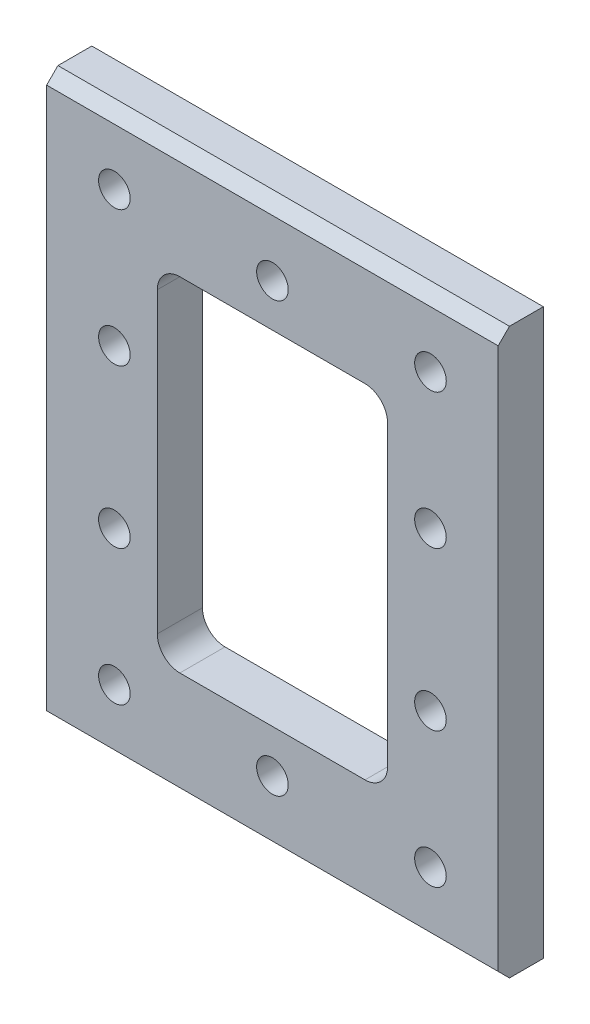
ISO-10303-21;
HEADER;
FILE_DESCRIPTION(('STEP AP214'),'2;1');
FILE_NAME('part.step','',(''),(''),'','','');
FILE_SCHEMA(('AUTOMOTIVE_DESIGN { 1 0 10303 214 1 1 1 1 }'));
ENDSEC;
DATA;
#1=APPLICATION_CONTEXT('core data for automotive mechanical design processes');
#2=APPLICATION_PROTOCOL_DEFINITION('international standard','automotive_design',2000,#1);
#3=PRODUCT_CONTEXT('',#1,'mechanical');
#4=PRODUCT('Part','Part','',(#3));
#5=PRODUCT_RELATED_PRODUCT_CATEGORY('part','',(#4));
#6=PRODUCT_DEFINITION_FORMATION('','',#4);
#7=PRODUCT_DEFINITION_CONTEXT('part definition',#1,'design');
#8=PRODUCT_DEFINITION('design','',#6,#7);
#9=PRODUCT_DEFINITION_SHAPE('','',#8);
#10=(LENGTH_UNIT() NAMED_UNIT(*) SI_UNIT(.MILLI.,.METRE.));
#11=(NAMED_UNIT(*) PLANE_ANGLE_UNIT() SI_UNIT($,.RADIAN.));
#12=(NAMED_UNIT(*) SI_UNIT($,.STERADIAN.) SOLID_ANGLE_UNIT());
#13=UNCERTAINTY_MEASURE_WITH_UNIT(LENGTH_MEASURE(1.E-05),#10,'distance_accuracy_value','');
#14=(GEOMETRIC_REPRESENTATION_CONTEXT(3) GLOBAL_UNCERTAINTY_ASSIGNED_CONTEXT((#13)) GLOBAL_UNIT_ASSIGNED_CONTEXT((#10,
#11,#12)) REPRESENTATION_CONTEXT('',''));
#15=CARTESIAN_POINT('',(0.,0.,0.));
#16=DIRECTION('',(0.,0.,1.));
#17=DIRECTION('',(1.,0.,0.));
#18=AXIS2_PLACEMENT_3D('',#15,#16,#17);
#19=CARTESIAN_POINT('',(100.,125.,20.));
#20=DIRECTION('',(-1.,0.,0.));
#21=DIRECTION('',(0.,-1.,0.));
#22=AXIS2_PLACEMENT_3D('',#19,#20,#21);
#23=PLANE('',#22);
#24=DIRECTION('',(0.,1.,0.));
#25=VECTOR('',#24,1.);
#26=CARTESIAN_POINT('',(100.,125.,20.));
#27=LINE('',#26,#25);
#28=CARTESIAN_POINT('',(100.,-120.,20.));
#29=VERTEX_POINT('',#28);
#30=CARTESIAN_POINT('',(100.,120.,20.));
#31=VERTEX_POINT('',#30);
#32=EDGE_CURVE('E201',#29,#31,#27,.T.);
#33=ORIENTED_EDGE('',*,*,#32,.F.);
#34=DIRECTION('',(0.,-0.707106781186546,-0.707106781186549));
#35=VECTOR('',#34,1.);
#36=CARTESIAN_POINT('',(100.,-120.,20.));
#37=LINE('',#36,#35);
#38=CARTESIAN_POINT('',(100.,-125.,15.));
#39=VERTEX_POINT('',#38);
#40=EDGE_CURVE('E234',#29,#39,#37,.T.);
#41=ORIENTED_EDGE('',*,*,#40,.T.);
#42=DIRECTION('',(0.,0.,-1.));
#43=VECTOR('',#42,1.);
#44=CARTESIAN_POINT('',(100.,-125.,20.));
#45=LINE('',#44,#43);
#46=CARTESIAN_POINT('',(100.,-125.,0.));
#47=VERTEX_POINT('',#46);
#48=EDGE_CURVE('E208',#39,#47,#45,.T.);
#49=ORIENTED_EDGE('',*,*,#48,.T.);
#50=DIRECTION('',(0.,1.,0.));
#51=VECTOR('',#50,1.);
#52=CARTESIAN_POINT('',(100.,125.,0.));
#53=LINE('',#52,#51);
#54=CARTESIAN_POINT('',(100.,125.,0.));
#55=VERTEX_POINT('',#54);
#56=EDGE_CURVE('E156',#47,#55,#53,.T.);
#57=ORIENTED_EDGE('',*,*,#56,.T.);
#58=DIRECTION('',(0.,0.,-1.));
#59=VECTOR('',#58,1.);
#60=CARTESIAN_POINT('',(100.,125.,20.));
#61=LINE('',#60,#59);
#62=CARTESIAN_POINT('',(100.,125.,15.));
#63=VERTEX_POINT('',#62);
#64=EDGE_CURVE('E224',#63,#55,#61,.T.);
#65=ORIENTED_EDGE('',*,*,#64,.F.);
#66=DIRECTION('',(0.,-0.707106781186546,0.707106781186549));
#67=VECTOR('',#66,1.);
#68=CARTESIAN_POINT('',(100.,120.,20.));
#69=LINE('',#68,#67);
#70=EDGE_CURVE('E232',#63,#31,#69,.T.);
#71=ORIENTED_EDGE('',*,*,#70,.T.);
#72=EDGE_LOOP('',(#33,#41,#49,#57,#65,#71));
#73=FACE_BOUND('',#72,.T.);
#74=ADVANCED_FACE('F35',(#73),#23,.F.);
#75=CARTESIAN_POINT('',(-100.,125.,20.));
#76=DIRECTION('',(0.,-1.,0.));
#77=DIRECTION('',(0.,0.,-1.));
#78=AXIS2_PLACEMENT_3D('',#75,#76,#77);
#79=PLANE('',#78);
#80=DIRECTION('',(0.,0.,-1.));
#81=VECTOR('',#80,1.);
#82=CARTESIAN_POINT('',(-100.,125.,20.));
#83=LINE('',#82,#81);
#84=CARTESIAN_POINT('',(-100.,125.,15.));
#85=VERTEX_POINT('',#84);
#86=CARTESIAN_POINT('',(-100.,125.,0.));
#87=VERTEX_POINT('',#86);
#88=EDGE_CURVE('E222',#85,#87,#83,.T.);
#89=ORIENTED_EDGE('',*,*,#88,.F.);
#90=DIRECTION('',(1.,0.,0.));
#91=VECTOR('',#90,1.);
#92=CARTESIAN_POINT('',(100.,125.,15.));
#93=LINE('',#92,#91);
#94=EDGE_CURVE('E11',#85,#63,#93,.T.);
#95=ORIENTED_EDGE('',*,*,#94,.T.);
#96=ORIENTED_EDGE('',*,*,#64,.T.);
#97=DIRECTION('',(-1.,0.,0.));
#98=VECTOR('',#97,1.);
#99=CARTESIAN_POINT('',(-100.,125.,0.));
#100=LINE('',#99,#98);
#101=EDGE_CURVE('E211',#55,#87,#100,.T.);
#102=ORIENTED_EDGE('',*,*,#101,.T.);
#103=EDGE_LOOP('',(#89,#95,#96,#102));
#104=FACE_BOUND('',#103,.T.);
#105=ADVANCED_FACE('F257',(#104),#79,.F.);
#106=CARTESIAN_POINT('',(-100.,125.,20.));
#107=DIRECTION('',(1.,0.,0.));
#108=DIRECTION('',(0.,1.,0.));
#109=AXIS2_PLACEMENT_3D('',#106,#107,#108);
#110=PLANE('',#109);
#111=DIRECTION('',(0.,0.,-1.));
#112=VECTOR('',#111,1.);
#113=CARTESIAN_POINT('',(-100.,-125.,20.));
#114=LINE('',#113,#112);
#115=CARTESIAN_POINT('',(-100.,-125.,15.));
#116=VERTEX_POINT('',#115);
#117=CARTESIAN_POINT('',(-100.,-125.,0.));
#118=VERTEX_POINT('',#117);
#119=EDGE_CURVE('E220',#116,#118,#114,.T.);
#120=ORIENTED_EDGE('',*,*,#119,.F.);
#121=DIRECTION('',(0.,0.707106781186546,0.707106781186549));
#122=VECTOR('',#121,1.);
#123=CARTESIAN_POINT('',(-100.,-120.,20.));
#124=LINE('',#123,#122);
#125=CARTESIAN_POINT('',(-100.,-120.,20.));
#126=VERTEX_POINT('',#125);
#127=EDGE_CURVE('E43',#116,#126,#124,.T.);
#128=ORIENTED_EDGE('',*,*,#127,.T.);
#129=DIRECTION('',(0.,-1.,0.));
#130=VECTOR('',#129,1.);
#131=CARTESIAN_POINT('',(-100.,125.,20.));
#132=LINE('',#131,#130);
#133=CARTESIAN_POINT('',(-100.,120.,20.));
#134=VERTEX_POINT('',#133);
#135=EDGE_CURVE('E204',#134,#126,#132,.T.);
#136=ORIENTED_EDGE('',*,*,#135,.F.);
#137=DIRECTION('',(0.,0.707106781186546,-0.707106781186549));
#138=VECTOR('',#137,1.);
#139=CARTESIAN_POINT('',(-100.,120.,20.));
#140=LINE('',#139,#138);
#141=EDGE_CURVE('E50',#134,#85,#140,.T.);
#142=ORIENTED_EDGE('',*,*,#141,.T.);
#143=ORIENTED_EDGE('',*,*,#88,.T.);
#144=DIRECTION('',(0.,-1.,0.));
#145=VECTOR('',#144,1.);
#146=CARTESIAN_POINT('',(-100.,125.,0.));
#147=LINE('',#146,#145);
#148=EDGE_CURVE('E214',#87,#118,#147,.T.);
#149=ORIENTED_EDGE('',*,*,#148,.T.);
#150=EDGE_LOOP('',(#120,#128,#136,#142,#143,#149));
#151=FACE_BOUND('',#150,.T.);
#152=ADVANCED_FACE('F238',(#151),#110,.F.);
#153=CARTESIAN_POINT('',(-100.,-125.,20.));
#154=DIRECTION('',(0.,1.,0.));
#155=DIRECTION('',(0.,0.,1.));
#156=AXIS2_PLACEMENT_3D('',#153,#154,#155);
#157=PLANE('',#156);
#158=ORIENTED_EDGE('',*,*,#48,.F.);
#159=DIRECTION('',(-1.,0.,0.));
#160=VECTOR('',#159,1.);
#161=CARTESIAN_POINT('',(-100.,-125.,15.));
#162=LINE('',#161,#160);
#163=EDGE_CURVE('E58',#39,#116,#162,.T.);
#164=ORIENTED_EDGE('',*,*,#163,.T.);
#165=ORIENTED_EDGE('',*,*,#119,.T.);
#166=DIRECTION('',(1.,0.,0.));
#167=VECTOR('',#166,1.);
#168=CARTESIAN_POINT('',(-100.,-125.,0.));
#169=LINE('',#168,#167);
#170=EDGE_CURVE('E205',#118,#47,#169,.T.);
#171=ORIENTED_EDGE('',*,*,#170,.T.);
#172=EDGE_LOOP('',(#158,#164,#165,#171));
#173=FACE_BOUND('',#172,.T.);
#174=ADVANCED_FACE('F247',(#173),#157,.F.);
#175=CARTESIAN_POINT('',(0.,0.,20.));
#176=DIRECTION('',(0.,0.,1.));
#177=DIRECTION('',(1.,0.,0.));
#178=AXIS2_PLACEMENT_3D('',#175,#176,#177);
#179=PLANE('',#178);
#180=CARTESIAN_POINT('',(70.,35.,20.));
#181=DIRECTION('',(0.,0.,1.));
#182=DIRECTION('',(1.,0.,0.));
#183=AXIS2_PLACEMENT_3D('',#180,#181,#182);
#184=CIRCLE('',#183,7.);
#185=CARTESIAN_POINT('',(77.,35.,20.));
#186=VERTEX_POINT('',#185);
#187=EDGE_CURVE('E522',#186,#186,#184,.T.);
#188=ORIENTED_EDGE('',*,*,#187,.F.);
#189=EDGE_LOOP('',(#188));
#190=FACE_BOUND('',#189,.T.);
#191=CARTESIAN_POINT('',(-70.,35.,20.));
#192=DIRECTION('',(0.,0.,1.));
#193=DIRECTION('',(1.,0.,0.));
#194=AXIS2_PLACEMENT_3D('',#191,#192,#193);
#195=CIRCLE('',#194,7.);
#196=CARTESIAN_POINT('',(-63.,35.,20.));
#197=VERTEX_POINT('',#196);
#198=EDGE_CURVE('E516',#197,#197,#195,.T.);
#199=ORIENTED_EDGE('',*,*,#198,.F.);
#200=EDGE_LOOP('',(#199));
#201=FACE_BOUND('',#200,.T.);
#202=CARTESIAN_POINT('',(70.,95.,20.));
#203=DIRECTION('',(0.,0.,1.));
#204=DIRECTION('',(1.,0.,0.));
#205=AXIS2_PLACEMENT_3D('',#202,#203,#204);
#206=CIRCLE('',#205,7.);
#207=CARTESIAN_POINT('',(77.,95.,20.));
#208=VERTEX_POINT('',#207);
#209=EDGE_CURVE('E503',#208,#208,#206,.T.);
#210=ORIENTED_EDGE('',*,*,#209,.F.);
#211=EDGE_LOOP('',(#210));
#212=FACE_BOUND('',#211,.T.);
#213=CARTESIAN_POINT('',(0.,95.,20.));
#214=DIRECTION('',(0.,0.,1.));
#215=DIRECTION('',(1.,0.,0.));
#216=AXIS2_PLACEMENT_3D('',#213,#214,#215);
#217=CIRCLE('',#216,7.);
#218=CARTESIAN_POINT('',(7.00000000000002,95.,20.));
#219=VERTEX_POINT('',#218);
#220=EDGE_CURVE('E508',#219,#219,#217,.T.);
#221=ORIENTED_EDGE('',*,*,#220,.F.);
#222=EDGE_LOOP('',(#221));
#223=FACE_BOUND('',#222,.T.);
#224=CARTESIAN_POINT('',(-70.,95.,20.));
#225=DIRECTION('',(0.,0.,1.));
#226=DIRECTION('',(1.,0.,0.));
#227=AXIS2_PLACEMENT_3D('',#224,#225,#226);
#228=CIRCLE('',#227,7.);
#229=CARTESIAN_POINT('',(-63.,95.,20.));
#230=VERTEX_POINT('',#229);
#231=EDGE_CURVE('E527',#230,#230,#228,.T.);
#232=ORIENTED_EDGE('',*,*,#231,.F.);
#233=EDGE_LOOP('',(#232));
#234=FACE_BOUND('',#233,.T.);
#235=CARTESIAN_POINT('',(70.,-95.,20.));
#236=DIRECTION('',(0.,0.,1.));
#237=DIRECTION('',(-1.,0.,0.));
#238=AXIS2_PLACEMENT_3D('',#235,#236,#237);
#239=CIRCLE('',#238,7.);
#240=CARTESIAN_POINT('',(63.,-95.,20.));
#241=VERTEX_POINT('',#240);
#242=EDGE_CURVE('E550',#241,#241,#239,.T.);
#243=ORIENTED_EDGE('',*,*,#242,.F.);
#244=EDGE_LOOP('',(#243));
#245=FACE_BOUND('',#244,.T.);
#246=CARTESIAN_POINT('',(70.,-35.,20.));
#247=DIRECTION('',(0.,0.,1.));
#248=DIRECTION('',(-1.,0.,0.));
#249=AXIS2_PLACEMENT_3D('',#246,#247,#248);
#250=CIRCLE('',#249,7.);
#251=CARTESIAN_POINT('',(63.,-35.,20.));
#252=VERTEX_POINT('',#251);
#253=EDGE_CURVE('E544',#252,#252,#250,.T.);
#254=ORIENTED_EDGE('',*,*,#253,.F.);
#255=EDGE_LOOP('',(#254));
#256=FACE_BOUND('',#255,.T.);
#257=CARTESIAN_POINT('',(-70.,-95.,20.));
#258=DIRECTION('',(0.,0.,1.));
#259=DIRECTION('',(-1.,0.,0.));
#260=AXIS2_PLACEMENT_3D('',#257,#258,#259);
#261=CIRCLE('',#260,7.);
#262=CARTESIAN_POINT('',(-77.,-95.,20.));
#263=VERTEX_POINT('',#262);
#264=EDGE_CURVE('E536',#263,#263,#261,.T.);
#265=ORIENTED_EDGE('',*,*,#264,.F.);
#266=EDGE_LOOP('',(#265));
#267=FACE_BOUND('',#266,.T.);
#268=CARTESIAN_POINT('',(0.,-95.,20.));
#269=DIRECTION('',(0.,0.,1.));
#270=DIRECTION('',(-1.,0.,0.));
#271=AXIS2_PLACEMENT_3D('',#268,#269,#270);
#272=CIRCLE('',#271,7.);
#273=CARTESIAN_POINT('',(-6.99999999999997,-95.,20.));
#274=VERTEX_POINT('',#273);
#275=EDGE_CURVE('E543',#274,#274,#272,.T.);
#276=ORIENTED_EDGE('',*,*,#275,.F.);
#277=EDGE_LOOP('',(#276));
#278=FACE_BOUND('',#277,.T.);
#279=CARTESIAN_POINT('',(-70.,-35.,20.));
#280=DIRECTION('',(0.,0.,1.));
#281=DIRECTION('',(-1.,0.,0.));
#282=AXIS2_PLACEMENT_3D('',#279,#280,#281);
#283=CIRCLE('',#282,7.);
#284=CARTESIAN_POINT('',(-77.,-35.,20.));
#285=VERTEX_POINT('',#284);
#286=EDGE_CURVE('E555',#285,#285,#283,.T.);
#287=ORIENTED_EDGE('',*,*,#286,.F.);
#288=EDGE_LOOP('',(#287));
#289=FACE_BOUND('',#288,.T.);
#290=CARTESIAN_POINT('',(-41.,-66.,20.));
#291=DIRECTION('',(0.,0.,1.));
#292=DIRECTION('',(1.,0.,0.));
#293=AXIS2_PLACEMENT_3D('',#290,#291,#292);
#294=CIRCLE('',#293,10.);
#295=CARTESIAN_POINT('',(-51.,-65.9999999999999,20.));
#296=VERTEX_POINT('',#295);
#297=CARTESIAN_POINT('',(-40.9999999999999,-76.,20.));
#298=VERTEX_POINT('',#297);
#299=EDGE_CURVE('E143',#296,#298,#294,.T.);
#300=ORIENTED_EDGE('',*,*,#299,.F.);
#301=DIRECTION('',(0.,-1.,0.));
#302=VECTOR('',#301,1.);
#303=CARTESIAN_POINT('',(-51.,65.9999999999999,20.));
#304=LINE('',#303,#302);
#305=CARTESIAN_POINT('',(-51.,65.9999999999999,20.));
#306=VERTEX_POINT('',#305);
#307=EDGE_CURVE('E148',#306,#296,#304,.T.);
#308=ORIENTED_EDGE('',*,*,#307,.F.);
#309=CARTESIAN_POINT('',(-41.,66.,20.));
#310=DIRECTION('',(0.,0.,1.));
#311=DIRECTION('',(1.,0.,0.));
#312=AXIS2_PLACEMENT_3D('',#309,#310,#311);
#313=CIRCLE('',#312,10.);
#314=CARTESIAN_POINT('',(-40.9999999999999,76.,20.));
#315=VERTEX_POINT('',#314);
#316=EDGE_CURVE('E184',#315,#306,#313,.T.);
#317=ORIENTED_EDGE('',*,*,#316,.F.);
#318=DIRECTION('',(-1.,0.,0.));
#319=VECTOR('',#318,1.);
#320=CARTESIAN_POINT('',(-40.9999999999999,76.,20.));
#321=LINE('',#320,#319);
#322=CARTESIAN_POINT('',(40.9999999999999,76.,20.));
#323=VERTEX_POINT('',#322);
#324=EDGE_CURVE('E181',#323,#315,#321,.T.);
#325=ORIENTED_EDGE('',*,*,#324,.F.);
#326=CARTESIAN_POINT('',(41.,66.,20.));
#327=DIRECTION('',(0.,0.,1.));
#328=DIRECTION('',(-1.,0.,0.));
#329=AXIS2_PLACEMENT_3D('',#326,#327,#328);
#330=CIRCLE('',#329,10.);
#331=CARTESIAN_POINT('',(51.,65.9999999999999,20.));
#332=VERTEX_POINT('',#331);
#333=EDGE_CURVE('E178',#332,#323,#330,.T.);
#334=ORIENTED_EDGE('',*,*,#333,.F.);
#335=DIRECTION('',(0.,1.,0.));
#336=VECTOR('',#335,1.);
#337=CARTESIAN_POINT('',(51.,65.9999999999999,20.));
#338=LINE('',#337,#336);
#339=CARTESIAN_POINT('',(51.,-65.9999999999999,20.));
#340=VERTEX_POINT('',#339);
#341=EDGE_CURVE('E175',#340,#332,#338,.T.);
#342=ORIENTED_EDGE('',*,*,#341,.F.);
#343=CARTESIAN_POINT('',(41.,-66.,20.));
#344=DIRECTION('',(0.,0.,1.));
#345=DIRECTION('',(1.,0.,0.));
#346=AXIS2_PLACEMENT_3D('',#343,#344,#345);
#347=CIRCLE('',#346,10.);
#348=CARTESIAN_POINT('',(40.9999999999999,-76.,20.));
#349=VERTEX_POINT('',#348);
#350=EDGE_CURVE('E172',#349,#340,#347,.T.);
#351=ORIENTED_EDGE('',*,*,#350,.F.);
#352=DIRECTION('',(1.,0.,0.));
#353=VECTOR('',#352,1.);
#354=CARTESIAN_POINT('',(-40.9999999999999,-76.,20.));
#355=LINE('',#354,#353);
#356=EDGE_CURVE('E165',#298,#349,#355,.T.);
#357=ORIENTED_EDGE('',*,*,#356,.F.);
#358=EDGE_LOOP('',(#300,#308,#317,#325,#334,#342,#351,#357));
#359=FACE_BOUND('',#358,.T.);
#360=ORIENTED_EDGE('',*,*,#135,.T.);
#361=DIRECTION('',(1.,0.,0.));
#362=VECTOR('',#361,1.);
#363=CARTESIAN_POINT('',(100.,-120.,20.));
#364=LINE('',#363,#362);
#365=EDGE_CURVE('E229',#126,#29,#364,.T.);
#366=ORIENTED_EDGE('',*,*,#365,.T.);
#367=ORIENTED_EDGE('',*,*,#32,.T.);
#368=DIRECTION('',(-1.,0.,0.));
#369=VECTOR('',#368,1.);
#370=CARTESIAN_POINT('',(-100.,120.,20.));
#371=LINE('',#370,#369);
#372=EDGE_CURVE('E226',#31,#134,#371,.T.);
#373=ORIENTED_EDGE('',*,*,#372,.T.);
#374=EDGE_LOOP('',(#360,#366,#367,#373));
#375=FACE_BOUND('',#374,.T.);
#376=ADVANCED_FACE('F242',(#190,#201,#212,#223,#234,#245,#256,#267,#278,#289,#359,#375),#179,.T.);
#377=CARTESIAN_POINT('',(0.,0.,0.));
#378=DIRECTION('',(0.,0.,1.));
#379=DIRECTION('',(1.,0.,0.));
#380=AXIS2_PLACEMENT_3D('',#377,#378,#379);
#381=PLANE('',#380);
#382=CARTESIAN_POINT('',(70.,35.,0.));
#383=DIRECTION('',(0.,0.,1.));
#384=DIRECTION('',(1.,0.,0.));
#385=AXIS2_PLACEMENT_3D('',#382,#383,#384);
#386=CIRCLE('',#385,7.);
#387=CARTESIAN_POINT('',(77.,35.,0.));
#388=VERTEX_POINT('',#387);
#389=EDGE_CURVE('E519',#388,#388,#386,.F.);
#390=ORIENTED_EDGE('',*,*,#389,.F.);
#391=EDGE_LOOP('',(#390));
#392=FACE_BOUND('',#391,.T.);
#393=CARTESIAN_POINT('',(-70.,35.,0.));
#394=DIRECTION('',(0.,0.,1.));
#395=DIRECTION('',(1.,0.,0.));
#396=AXIS2_PLACEMENT_3D('',#393,#394,#395);
#397=CIRCLE('',#396,7.);
#398=CARTESIAN_POINT('',(-63.,35.,0.));
#399=VERTEX_POINT('',#398);
#400=EDGE_CURVE('E513',#399,#399,#397,.F.);
#401=ORIENTED_EDGE('',*,*,#400,.F.);
#402=EDGE_LOOP('',(#401));
#403=FACE_BOUND('',#402,.T.);
#404=CARTESIAN_POINT('',(70.,95.,0.));
#405=DIRECTION('',(0.,0.,1.));
#406=DIRECTION('',(1.,0.,0.));
#407=AXIS2_PLACEMENT_3D('',#404,#405,#406);
#408=CIRCLE('',#407,7.);
#409=CARTESIAN_POINT('',(77.,95.,0.));
#410=VERTEX_POINT('',#409);
#411=EDGE_CURVE('E506',#410,#410,#408,.F.);
#412=ORIENTED_EDGE('',*,*,#411,.F.);
#413=EDGE_LOOP('',(#412));
#414=FACE_BOUND('',#413,.T.);
#415=CARTESIAN_POINT('',(0.,95.,0.));
#416=DIRECTION('',(0.,0.,1.));
#417=DIRECTION('',(1.,0.,0.));
#418=AXIS2_PLACEMENT_3D('',#415,#416,#417);
#419=CIRCLE('',#418,7.);
#420=CARTESIAN_POINT('',(7.00000000000002,95.,0.));
#421=VERTEX_POINT('',#420);
#422=EDGE_CURVE('E511',#421,#421,#419,.F.);
#423=ORIENTED_EDGE('',*,*,#422,.F.);
#424=EDGE_LOOP('',(#423));
#425=FACE_BOUND('',#424,.T.);
#426=CARTESIAN_POINT('',(-70.,95.,0.));
#427=DIRECTION('',(0.,0.,1.));
#428=DIRECTION('',(1.,0.,0.));
#429=AXIS2_PLACEMENT_3D('',#426,#427,#428);
#430=CIRCLE('',#429,7.);
#431=CARTESIAN_POINT('',(-63.,95.,0.));
#432=VERTEX_POINT('',#431);
#433=EDGE_CURVE('E530',#432,#432,#430,.F.);
#434=ORIENTED_EDGE('',*,*,#433,.F.);
#435=EDGE_LOOP('',(#434));
#436=FACE_BOUND('',#435,.T.);
#437=CARTESIAN_POINT('',(70.,-95.,0.));
#438=DIRECTION('',(0.,0.,1.));
#439=DIRECTION('',(1.,0.,0.));
#440=AXIS2_PLACEMENT_3D('',#437,#438,#439);
#441=CIRCLE('',#440,7.);
#442=CARTESIAN_POINT('',(77.0000000000001,-95.,0.));
#443=VERTEX_POINT('',#442);
#444=EDGE_CURVE('E547',#443,#443,#441,.F.);
#445=ORIENTED_EDGE('',*,*,#444,.F.);
#446=EDGE_LOOP('',(#445));
#447=FACE_BOUND('',#446,.T.);
#448=CARTESIAN_POINT('',(70.,-35.,0.));
#449=DIRECTION('',(0.,0.,1.));
#450=DIRECTION('',(1.,0.,0.));
#451=AXIS2_PLACEMENT_3D('',#448,#449,#450);
#452=CIRCLE('',#451,7.);
#453=CARTESIAN_POINT('',(77.0000000000001,-35.,0.));
#454=VERTEX_POINT('',#453);
#455=EDGE_CURVE('E540',#454,#454,#452,.F.);
#456=ORIENTED_EDGE('',*,*,#455,.F.);
#457=EDGE_LOOP('',(#456));
#458=FACE_BOUND('',#457,.T.);
#459=CARTESIAN_POINT('',(-70.,-95.,0.));
#460=DIRECTION('',(0.,0.,1.));
#461=DIRECTION('',(1.,0.,0.));
#462=AXIS2_PLACEMENT_3D('',#459,#460,#461);
#463=CIRCLE('',#462,7.);
#464=CARTESIAN_POINT('',(-63.,-95.,0.));
#465=VERTEX_POINT('',#464);
#466=EDGE_CURVE('E539',#465,#465,#463,.F.);
#467=ORIENTED_EDGE('',*,*,#466,.F.);
#468=EDGE_LOOP('',(#467));
#469=FACE_BOUND('',#468,.T.);
#470=CARTESIAN_POINT('',(0.,-95.,0.));
#471=DIRECTION('',(0.,0.,1.));
#472=DIRECTION('',(1.,0.,0.));
#473=AXIS2_PLACEMENT_3D('',#470,#471,#472);
#474=CIRCLE('',#473,7.);
#475=CARTESIAN_POINT('',(7.00000000000004,-95.,0.));
#476=VERTEX_POINT('',#475);
#477=EDGE_CURVE('E558',#476,#476,#474,.F.);
#478=ORIENTED_EDGE('',*,*,#477,.F.);
#479=EDGE_LOOP('',(#478));
#480=FACE_BOUND('',#479,.T.);
#481=CARTESIAN_POINT('',(-70.,-35.,0.));
#482=DIRECTION('',(0.,0.,1.));
#483=DIRECTION('',(1.,0.,0.));
#484=AXIS2_PLACEMENT_3D('',#481,#482,#483);
#485=CIRCLE('',#484,7.);
#486=CARTESIAN_POINT('',(-63.,-35.,0.));
#487=VERTEX_POINT('',#486);
#488=EDGE_CURVE('E524',#487,#487,#485,.F.);
#489=ORIENTED_EDGE('',*,*,#488,.F.);
#490=EDGE_LOOP('',(#489));
#491=FACE_BOUND('',#490,.T.);
#492=DIRECTION('',(0.,1.,0.));
#493=VECTOR('',#492,1.);
#494=CARTESIAN_POINT('',(-51.,65.9999999999999,0.));
#495=LINE('',#494,#493);
#496=CARTESIAN_POINT('',(-51.,-65.9999999999999,0.));
#497=VERTEX_POINT('',#496);
#498=CARTESIAN_POINT('',(-51.,65.9999999999999,0.));
#499=VERTEX_POINT('',#498);
#500=EDGE_CURVE('E163',#497,#499,#495,.T.);
#501=ORIENTED_EDGE('',*,*,#500,.F.);
#502=CARTESIAN_POINT('',(-41.,-66.,0.));
#503=DIRECTION('',(0.,0.,1.));
#504=DIRECTION('',(1.,0.,0.));
#505=AXIS2_PLACEMENT_3D('',#502,#503,#504);
#506=CIRCLE('',#505,10.);
#507=CARTESIAN_POINT('',(-40.9999999999999,-76.,0.));
#508=VERTEX_POINT('',#507);
#509=EDGE_CURVE('E140',#508,#497,#506,.F.);
#510=ORIENTED_EDGE('',*,*,#509,.F.);
#511=DIRECTION('',(-1.,0.,0.));
#512=VECTOR('',#511,1.);
#513=CARTESIAN_POINT('',(-40.9999999999999,-76.,0.));
#514=LINE('',#513,#512);
#515=CARTESIAN_POINT('',(40.9999999999999,-76.,0.));
#516=VERTEX_POINT('',#515);
#517=EDGE_CURVE('E152',#516,#508,#514,.T.);
#518=ORIENTED_EDGE('',*,*,#517,.F.);
#519=CARTESIAN_POINT('',(41.,-66.,0.));
#520=DIRECTION('',(0.,0.,1.));
#521=DIRECTION('',(1.,0.,0.));
#522=AXIS2_PLACEMENT_3D('',#519,#520,#521);
#523=CIRCLE('',#522,10.);
#524=CARTESIAN_POINT('',(51.,-65.9999999999999,0.));
#525=VERTEX_POINT('',#524);
#526=EDGE_CURVE('E532',#525,#516,#523,.F.);
#527=ORIENTED_EDGE('',*,*,#526,.F.);
#528=DIRECTION('',(0.,-1.,0.));
#529=VECTOR('',#528,1.);
#530=CARTESIAN_POINT('',(51.,65.9999999999999,0.));
#531=LINE('',#530,#529);
#532=CARTESIAN_POINT('',(51.,65.9999999999999,0.));
#533=VERTEX_POINT('',#532);
#534=EDGE_CURVE('E566',#533,#525,#531,.T.);
#535=ORIENTED_EDGE('',*,*,#534,.F.);
#536=CARTESIAN_POINT('',(41.,66.,0.));
#537=DIRECTION('',(0.,0.,1.));
#538=DIRECTION('',(1.,0.,0.));
#539=AXIS2_PLACEMENT_3D('',#536,#537,#538);
#540=CIRCLE('',#539,10.);
#541=CARTESIAN_POINT('',(40.9999999999999,76.,0.));
#542=VERTEX_POINT('',#541);
#543=EDGE_CURVE('E569',#542,#533,#540,.F.);
#544=ORIENTED_EDGE('',*,*,#543,.F.);
#545=DIRECTION('',(1.,0.,0.));
#546=VECTOR('',#545,1.);
#547=CARTESIAN_POINT('',(-40.9999999999999,76.,0.));
#548=LINE('',#547,#546);
#549=CARTESIAN_POINT('',(-40.9999999999999,76.,0.));
#550=VERTEX_POINT('',#549);
#551=EDGE_CURVE('E572',#550,#542,#548,.T.);
#552=ORIENTED_EDGE('',*,*,#551,.F.);
#553=CARTESIAN_POINT('',(-41.,66.,0.));
#554=DIRECTION('',(0.,0.,1.));
#555=DIRECTION('',(1.,0.,0.));
#556=AXIS2_PLACEMENT_3D('',#553,#554,#555);
#557=CIRCLE('',#556,10.);
#558=EDGE_CURVE('E167',#499,#550,#557,.F.);
#559=ORIENTED_EDGE('',*,*,#558,.F.);
#560=EDGE_LOOP('',(#501,#510,#518,#527,#535,#544,#552,#559));
#561=FACE_BOUND('',#560,.T.);
#562=ORIENTED_EDGE('',*,*,#56,.F.);
#563=ORIENTED_EDGE('',*,*,#170,.F.);
#564=ORIENTED_EDGE('',*,*,#148,.F.);
#565=ORIENTED_EDGE('',*,*,#101,.F.);
#566=EDGE_LOOP('',(#562,#563,#564,#565));
#567=FACE_BOUND('',#566,.T.);
#568=ADVANCED_FACE('F159',(#392,#403,#414,#425,#436,#447,#458,#469,#480,#491,#561,#567),#381,.F.);
#569=CARTESIAN_POINT('',(-41.,-66.,-0.001000000000001));
#570=DIRECTION('',(0.,0.,1.));
#571=DIRECTION('',(1.,0.,0.));
#572=AXIS2_PLACEMENT_3D('',#569,#570,#571);
#573=CYLINDRICAL_SURFACE('',#572,10.);
#574=ORIENTED_EDGE('',*,*,#509,.T.);
#575=DIRECTION('',(0.,0.,1.));
#576=VECTOR('',#575,1.);
#577=CARTESIAN_POINT('',(-51.,-65.9999999999999,-0.001000000000001));
#578=LINE('',#577,#576);
#579=EDGE_CURVE('E157',#497,#296,#578,.T.);
#580=ORIENTED_EDGE('',*,*,#579,.T.);
#581=ORIENTED_EDGE('',*,*,#299,.T.);
#582=DIRECTION('',(0.,0.,1.));
#583=VECTOR('',#582,1.);
#584=CARTESIAN_POINT('',(-40.9999999999999,-76.,-0.001000000000001));
#585=LINE('',#584,#583);
#586=EDGE_CURVE('E136',#508,#298,#585,.T.);
#587=ORIENTED_EDGE('',*,*,#586,.F.);
#588=EDGE_LOOP('',(#574,#580,#581,#587));
#589=FACE_BOUND('',#588,.T.);
#590=ADVANCED_FACE('F138',(#589),#573,.F.);
#591=CARTESIAN_POINT('',(-51.,65.9999999999999,-0.001000000000001));
#592=DIRECTION('',(-1.,0.,0.));
#593=DIRECTION('',(0.,-1.,0.));
#594=AXIS2_PLACEMENT_3D('',#591,#592,#593);
#595=PLANE('',#594);
#596=ORIENTED_EDGE('',*,*,#500,.T.);
#597=DIRECTION('',(0.,0.,1.));
#598=VECTOR('',#597,1.);
#599=CARTESIAN_POINT('',(-51.,65.9999999999999,-0.001000000000001));
#600=LINE('',#599,#598);
#601=EDGE_CURVE('E190',#499,#306,#600,.T.);
#602=ORIENTED_EDGE('',*,*,#601,.T.);
#603=ORIENTED_EDGE('',*,*,#307,.T.);
#604=ORIENTED_EDGE('',*,*,#579,.F.);
#605=EDGE_LOOP('',(#596,#602,#603,#604));
#606=FACE_BOUND('',#605,.T.);
#607=ADVANCED_FACE('F314',(#606),#595,.F.);
#608=CARTESIAN_POINT('',(-41.,66.,-0.001000000000001));
#609=DIRECTION('',(0.,0.,1.));
#610=DIRECTION('',(1.,0.,0.));
#611=AXIS2_PLACEMENT_3D('',#608,#609,#610);
#612=CYLINDRICAL_SURFACE('',#611,10.);
#613=ORIENTED_EDGE('',*,*,#558,.T.);
#614=DIRECTION('',(0.,0.,1.));
#615=VECTOR('',#614,1.);
#616=CARTESIAN_POINT('',(-40.9999999999999,76.,-0.001000000000001));
#617=LINE('',#616,#615);
#618=EDGE_CURVE('E192',#550,#315,#617,.T.);
#619=ORIENTED_EDGE('',*,*,#618,.T.);
#620=ORIENTED_EDGE('',*,*,#316,.T.);
#621=ORIENTED_EDGE('',*,*,#601,.F.);
#622=EDGE_LOOP('',(#613,#619,#620,#621));
#623=FACE_BOUND('',#622,.T.);
#624=ADVANCED_FACE('F317',(#623),#612,.F.);
#625=CARTESIAN_POINT('',(-40.9999999999999,76.,-0.001000000000001));
#626=DIRECTION('',(0.,1.,0.));
#627=DIRECTION('',(0.,0.,1.));
#628=AXIS2_PLACEMENT_3D('',#625,#626,#627);
#629=PLANE('',#628);
#630=ORIENTED_EDGE('',*,*,#551,.T.);
#631=DIRECTION('',(0.,0.,1.));
#632=VECTOR('',#631,1.);
#633=CARTESIAN_POINT('',(40.9999999999999,76.,-0.001000000000001));
#634=LINE('',#633,#632);
#635=EDGE_CURVE('E194',#542,#323,#634,.T.);
#636=ORIENTED_EDGE('',*,*,#635,.T.);
#637=ORIENTED_EDGE('',*,*,#324,.T.);
#638=ORIENTED_EDGE('',*,*,#618,.F.);
#639=EDGE_LOOP('',(#630,#636,#637,#638));
#640=FACE_BOUND('',#639,.T.);
#641=ADVANCED_FACE('F321',(#640),#629,.F.);
#642=CARTESIAN_POINT('',(41.,66.,-0.001000000000001));
#643=DIRECTION('',(0.,0.,1.));
#644=DIRECTION('',(1.,0.,0.));
#645=AXIS2_PLACEMENT_3D('',#642,#643,#644);
#646=CYLINDRICAL_SURFACE('',#645,10.);
#647=ORIENTED_EDGE('',*,*,#543,.T.);
#648=DIRECTION('',(0.,0.,1.));
#649=VECTOR('',#648,1.);
#650=CARTESIAN_POINT('',(51.,65.9999999999999,-0.001000000000001));
#651=LINE('',#650,#649);
#652=EDGE_CURVE('E196',#533,#332,#651,.T.);
#653=ORIENTED_EDGE('',*,*,#652,.T.);
#654=ORIENTED_EDGE('',*,*,#333,.T.);
#655=ORIENTED_EDGE('',*,*,#635,.F.);
#656=EDGE_LOOP('',(#647,#653,#654,#655));
#657=FACE_BOUND('',#656,.T.);
#658=ADVANCED_FACE('F325',(#657),#646,.F.);
#659=CARTESIAN_POINT('',(51.,65.9999999999999,-0.001000000000001));
#660=DIRECTION('',(1.,0.,0.));
#661=DIRECTION('',(0.,1.,0.));
#662=AXIS2_PLACEMENT_3D('',#659,#660,#661);
#663=PLANE('',#662);
#664=ORIENTED_EDGE('',*,*,#534,.T.);
#665=DIRECTION('',(0.,0.,1.));
#666=VECTOR('',#665,1.);
#667=CARTESIAN_POINT('',(51.,-65.9999999999999,-0.001000000000001));
#668=LINE('',#667,#666);
#669=EDGE_CURVE('E198',#525,#340,#668,.T.);
#670=ORIENTED_EDGE('',*,*,#669,.T.);
#671=ORIENTED_EDGE('',*,*,#341,.T.);
#672=ORIENTED_EDGE('',*,*,#652,.F.);
#673=EDGE_LOOP('',(#664,#670,#671,#672));
#674=FACE_BOUND('',#673,.T.);
#675=ADVANCED_FACE('F329',(#674),#663,.F.);
#676=CARTESIAN_POINT('',(41.,-66.,-0.001000000000001));
#677=DIRECTION('',(0.,0.,1.));
#678=DIRECTION('',(1.,0.,0.));
#679=AXIS2_PLACEMENT_3D('',#676,#677,#678);
#680=CYLINDRICAL_SURFACE('',#679,10.);
#681=ORIENTED_EDGE('',*,*,#526,.T.);
#682=DIRECTION('',(0.,0.,1.));
#683=VECTOR('',#682,1.);
#684=CARTESIAN_POINT('',(40.9999999999999,-76.,-0.001000000000001));
#685=LINE('',#684,#683);
#686=EDGE_CURVE('E147',#516,#349,#685,.T.);
#687=ORIENTED_EDGE('',*,*,#686,.T.);
#688=ORIENTED_EDGE('',*,*,#350,.T.);
#689=ORIENTED_EDGE('',*,*,#669,.F.);
#690=EDGE_LOOP('',(#681,#687,#688,#689));
#691=FACE_BOUND('',#690,.T.);
#692=ADVANCED_FACE('F333',(#691),#680,.F.);
#693=CARTESIAN_POINT('',(-40.9999999999999,-76.,-0.001000000000001));
#694=DIRECTION('',(0.,-1.,0.));
#695=DIRECTION('',(0.,0.,-1.));
#696=AXIS2_PLACEMENT_3D('',#693,#694,#695);
#697=PLANE('',#696);
#698=ORIENTED_EDGE('',*,*,#517,.T.);
#699=ORIENTED_EDGE('',*,*,#586,.T.);
#700=ORIENTED_EDGE('',*,*,#356,.T.);
#701=ORIENTED_EDGE('',*,*,#686,.F.);
#702=EDGE_LOOP('',(#698,#699,#700,#701));
#703=FACE_BOUND('',#702,.T.);
#704=ADVANCED_FACE('F153',(#703),#697,.F.);
#705=CARTESIAN_POINT('',(-70.,-35.,-0.001000000000001));
#706=DIRECTION('',(0.,0.,1.));
#707=DIRECTION('',(1.,0.,0.));
#708=AXIS2_PLACEMENT_3D('',#705,#706,#707);
#709=CYLINDRICAL_SURFACE('',#708,7.);
#710=ORIENTED_EDGE('',*,*,#286,.T.);
#711=EDGE_LOOP('',(#710));
#712=FACE_BOUND('',#711,.T.);
#713=ORIENTED_EDGE('',*,*,#488,.T.);
#714=EDGE_LOOP('',(#713));
#715=FACE_BOUND('',#714,.T.);
#716=ADVANCED_FACE('F307',(#712,#715),#709,.F.);
#717=CARTESIAN_POINT('',(0.,-95.,-0.001000000000001));
#718=DIRECTION('',(0.,0.,1.));
#719=DIRECTION('',(1.,0.,0.));
#720=AXIS2_PLACEMENT_3D('',#717,#718,#719);
#721=CYLINDRICAL_SURFACE('',#720,7.);
#722=ORIENTED_EDGE('',*,*,#275,.T.);
#723=EDGE_LOOP('',(#722));
#724=FACE_BOUND('',#723,.T.);
#725=ORIENTED_EDGE('',*,*,#477,.T.);
#726=EDGE_LOOP('',(#725));
#727=FACE_BOUND('',#726,.T.);
#728=ADVANCED_FACE('F299',(#724,#727),#721,.F.);
#729=CARTESIAN_POINT('',(-70.,-95.,-0.001000000000001));
#730=DIRECTION('',(0.,0.,1.));
#731=DIRECTION('',(1.,0.,0.));
#732=AXIS2_PLACEMENT_3D('',#729,#730,#731);
#733=CYLINDRICAL_SURFACE('',#732,7.);
#734=ORIENTED_EDGE('',*,*,#264,.T.);
#735=EDGE_LOOP('',(#734));
#736=FACE_BOUND('',#735,.T.);
#737=ORIENTED_EDGE('',*,*,#466,.T.);
#738=EDGE_LOOP('',(#737));
#739=FACE_BOUND('',#738,.T.);
#740=ADVANCED_FACE('F295',(#736,#739),#733,.F.);
#741=CARTESIAN_POINT('',(70.,-35.,-0.001000000000001));
#742=DIRECTION('',(0.,0.,1.));
#743=DIRECTION('',(1.,0.,0.));
#744=AXIS2_PLACEMENT_3D('',#741,#742,#743);
#745=CYLINDRICAL_SURFACE('',#744,7.);
#746=ORIENTED_EDGE('',*,*,#253,.T.);
#747=EDGE_LOOP('',(#746));
#748=FACE_BOUND('',#747,.T.);
#749=ORIENTED_EDGE('',*,*,#455,.T.);
#750=EDGE_LOOP('',(#749));
#751=FACE_BOUND('',#750,.T.);
#752=ADVANCED_FACE('F298',(#748,#751),#745,.F.);
#753=CARTESIAN_POINT('',(70.,-95.,-0.001000000000001));
#754=DIRECTION('',(0.,0.,1.));
#755=DIRECTION('',(1.,0.,0.));
#756=AXIS2_PLACEMENT_3D('',#753,#754,#755);
#757=CYLINDRICAL_SURFACE('',#756,7.);
#758=ORIENTED_EDGE('',*,*,#242,.T.);
#759=EDGE_LOOP('',(#758));
#760=FACE_BOUND('',#759,.T.);
#761=ORIENTED_EDGE('',*,*,#444,.T.);
#762=EDGE_LOOP('',(#761));
#763=FACE_BOUND('',#762,.T.);
#764=ADVANCED_FACE('F290',(#760,#763),#757,.F.);
#765=CARTESIAN_POINT('',(-70.,95.,-0.001000000000001));
#766=DIRECTION('',(0.,0.,1.));
#767=DIRECTION('',(1.,0.,0.));
#768=AXIS2_PLACEMENT_3D('',#765,#766,#767);
#769=CYLINDRICAL_SURFACE('',#768,7.);
#770=ORIENTED_EDGE('',*,*,#231,.T.);
#771=EDGE_LOOP('',(#770));
#772=FACE_BOUND('',#771,.T.);
#773=ORIENTED_EDGE('',*,*,#433,.T.);
#774=EDGE_LOOP('',(#773));
#775=FACE_BOUND('',#774,.T.);
#776=ADVANCED_FACE('F286',(#772,#775),#769,.F.);
#777=CARTESIAN_POINT('',(0.,95.,-0.001000000000001));
#778=DIRECTION('',(0.,0.,1.));
#779=DIRECTION('',(1.,0.,0.));
#780=AXIS2_PLACEMENT_3D('',#777,#778,#779);
#781=CYLINDRICAL_SURFACE('',#780,7.);
#782=ORIENTED_EDGE('',*,*,#220,.T.);
#783=EDGE_LOOP('',(#782));
#784=FACE_BOUND('',#783,.T.);
#785=ORIENTED_EDGE('',*,*,#422,.T.);
#786=EDGE_LOOP('',(#785));
#787=FACE_BOUND('',#786,.T.);
#788=ADVANCED_FACE('F289',(#784,#787),#781,.F.);
#789=CARTESIAN_POINT('',(70.,95.,-0.001000000000001));
#790=DIRECTION('',(0.,0.,1.));
#791=DIRECTION('',(1.,0.,0.));
#792=AXIS2_PLACEMENT_3D('',#789,#790,#791);
#793=CYLINDRICAL_SURFACE('',#792,7.);
#794=ORIENTED_EDGE('',*,*,#209,.T.);
#795=EDGE_LOOP('',(#794));
#796=FACE_BOUND('',#795,.T.);
#797=ORIENTED_EDGE('',*,*,#411,.T.);
#798=EDGE_LOOP('',(#797));
#799=FACE_BOUND('',#798,.T.);
#800=ADVANCED_FACE('F279',(#796,#799),#793,.F.);
#801=CARTESIAN_POINT('',(-70.,35.,-0.001000000000001));
#802=DIRECTION('',(0.,0.,1.));
#803=DIRECTION('',(1.,0.,0.));
#804=AXIS2_PLACEMENT_3D('',#801,#802,#803);
#805=CYLINDRICAL_SURFACE('',#804,7.);
#806=ORIENTED_EDGE('',*,*,#198,.T.);
#807=EDGE_LOOP('',(#806));
#808=FACE_BOUND('',#807,.T.);
#809=ORIENTED_EDGE('',*,*,#400,.T.);
#810=EDGE_LOOP('',(#809));
#811=FACE_BOUND('',#810,.T.);
#812=ADVANCED_FACE('F273',(#808,#811),#805,.F.);
#813=CARTESIAN_POINT('',(70.,35.,-0.001000000000001));
#814=DIRECTION('',(0.,0.,1.));
#815=DIRECTION('',(1.,0.,0.));
#816=AXIS2_PLACEMENT_3D('',#813,#814,#815);
#817=CYLINDRICAL_SURFACE('',#816,7.);
#818=ORIENTED_EDGE('',*,*,#187,.T.);
#819=EDGE_LOOP('',(#818));
#820=FACE_BOUND('',#819,.T.);
#821=ORIENTED_EDGE('',*,*,#389,.T.);
#822=EDGE_LOOP('',(#821));
#823=FACE_BOUND('',#822,.T.);
#824=ADVANCED_FACE('F268',(#820,#823),#817,.F.);
#825=CARTESIAN_POINT('',(0.,-120.,20.));
#826=DIRECTION('',(0.,-0.707106781186549,0.707106781186545));
#827=DIRECTION('',(-1.,0.,0.));
#828=AXIS2_PLACEMENT_3D('',#825,#826,#827);
#829=PLANE('',#828);
#830=ORIENTED_EDGE('',*,*,#127,.F.);
#831=ORIENTED_EDGE('',*,*,#163,.F.);
#832=ORIENTED_EDGE('',*,*,#40,.F.);
#833=ORIENTED_EDGE('',*,*,#365,.F.);
#834=EDGE_LOOP('',(#830,#831,#832,#833));
#835=FACE_BOUND('',#834,.T.);
#836=ADVANCED_FACE('F245',(#835),#829,.T.);
#837=CARTESIAN_POINT('',(0.,120.,20.));
#838=DIRECTION('',(0.,0.707106781186549,0.707106781186545));
#839=DIRECTION('',(1.,0.,0.));
#840=AXIS2_PLACEMENT_3D('',#837,#838,#839);
#841=PLANE('',#840);
#842=ORIENTED_EDGE('',*,*,#70,.F.);
#843=ORIENTED_EDGE('',*,*,#94,.F.);
#844=ORIENTED_EDGE('',*,*,#141,.F.);
#845=ORIENTED_EDGE('',*,*,#372,.F.);
#846=EDGE_LOOP('',(#842,#843,#844,#845));
#847=FACE_BOUND('',#846,.T.);
#848=ADVANCED_FACE('F37',(#847),#841,.T.);
#849=CLOSED_SHELL('',(#74,#105,#152,#174,#376,#568,#590,#607,#624,#641,#658,#675,#692,#704,#716,
#728,#740,#752,#764,#776,#788,#800,#812,#824,#836,#848));
#850=MANIFOLD_SOLID_BREP('B2',#849);
#851=ADVANCED_BREP_SHAPE_REPRESENTATION('',(#18,#850),#14);
#852=SHAPE_DEFINITION_REPRESENTATION(#9,#851);
ENDSEC;
END-ISO-10303-21;
